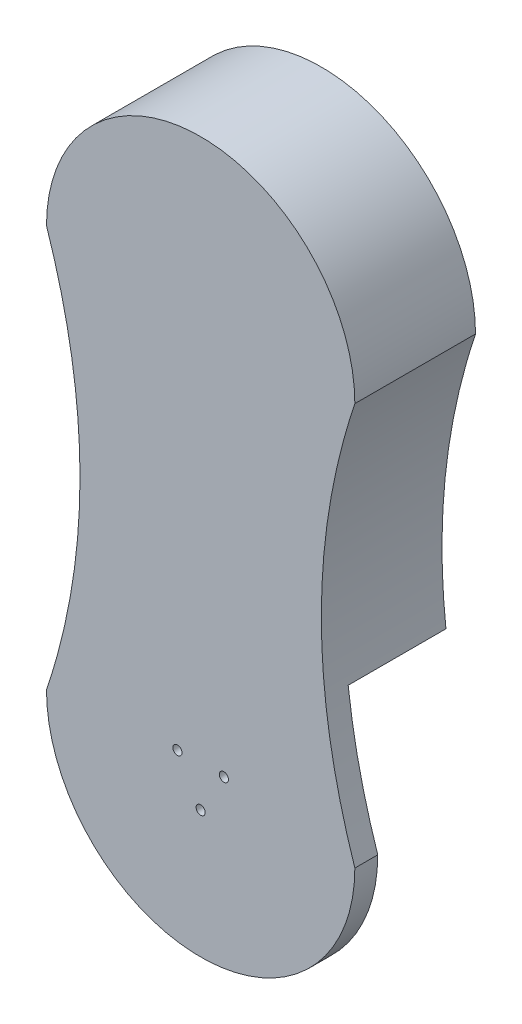
ISO-10303-21;
HEADER;
FILE_DESCRIPTION(('STEP AP214'),'2;1');
FILE_NAME('part.step','',(''),(''),'','','');
FILE_SCHEMA(('AUTOMOTIVE_DESIGN { 1 0 10303 214 1 1 1 1 }'));
ENDSEC;
DATA;
#1=APPLICATION_CONTEXT('core data for automotive mechanical design processes');
#2=APPLICATION_PROTOCOL_DEFINITION('international standard','automotive_design',2000,#1);
#3=PRODUCT_CONTEXT('',#1,'mechanical');
#4=PRODUCT('Part','Part','',(#3));
#5=PRODUCT_RELATED_PRODUCT_CATEGORY('part','',(#4));
#6=PRODUCT_DEFINITION_FORMATION('','',#4);
#7=PRODUCT_DEFINITION_CONTEXT('part definition',#1,'design');
#8=PRODUCT_DEFINITION('design','',#6,#7);
#9=PRODUCT_DEFINITION_SHAPE('','',#8);
#10=(LENGTH_UNIT() NAMED_UNIT(*) SI_UNIT(.MILLI.,.METRE.));
#11=(NAMED_UNIT(*) PLANE_ANGLE_UNIT() SI_UNIT($,.RADIAN.));
#12=(NAMED_UNIT(*) SI_UNIT($,.STERADIAN.) SOLID_ANGLE_UNIT());
#13=UNCERTAINTY_MEASURE_WITH_UNIT(LENGTH_MEASURE(1.E-05),#10,'distance_accuracy_value','');
#14=(GEOMETRIC_REPRESENTATION_CONTEXT(3) GLOBAL_UNCERTAINTY_ASSIGNED_CONTEXT((#13)) GLOBAL_UNIT_ASSIGNED_CONTEXT((#10,
#11,#12)) REPRESENTATION_CONTEXT('',''));
#15=CARTESIAN_POINT('',(0.,0.,0.));
#16=DIRECTION('',(0.,0.,1.));
#17=DIRECTION('',(1.,0.,0.));
#18=AXIS2_PLACEMENT_3D('',#15,#16,#17);
#19=CARTESIAN_POINT('',(0.,0.,90.));
#20=DIRECTION('',(0.,0.,-1.));
#21=DIRECTION('',(-1.,0.,0.));
#22=AXIS2_PLACEMENT_3D('',#19,#20,#21);
#23=CYLINDRICAL_SURFACE('',#22,115.);
#24=CARTESIAN_POINT('',(0.,0.,72.91));
#25=DIRECTION('',(0.,0.,-1.));
#26=DIRECTION('',(-1.,0.,0.));
#27=AXIS2_PLACEMENT_3D('',#24,#25,#26);
#28=CIRCLE('',#27,115.);
#29=CARTESIAN_POINT('',(-115.,0.,72.91));
#30=VERTEX_POINT('',#29);
#31=CARTESIAN_POINT('',(115.000000039863,-1.19495524586455E-07,72.91));
#32=VERTEX_POINT('',#31);
#33=EDGE_CURVE('E150',#30,#32,#28,.F.);
#34=ORIENTED_EDGE('',*,*,#33,.T.);
#35=DIRECTION('',(0.,0.,-1.));
#36=VECTOR('',#35,1.);
#37=CARTESIAN_POINT('',(115.,0.,90.));
#38=LINE('',#37,#36);
#39=CARTESIAN_POINT('',(115.,0.,90.));
#40=VERTEX_POINT('',#39);
#41=EDGE_CURVE('E51',#40,#32,#38,.T.);
#42=ORIENTED_EDGE('',*,*,#41,.F.);
#43=CARTESIAN_POINT('',(0.,0.,90.));
#44=DIRECTION('',(0.,0.,1.));
#45=DIRECTION('',(1.,0.,0.));
#46=AXIS2_PLACEMENT_3D('',#43,#44,#45);
#47=CIRCLE('',#46,115.);
#48=CARTESIAN_POINT('',(-115.,0.,90.));
#49=VERTEX_POINT('',#48);
#50=EDGE_CURVE('E90',#49,#40,#47,.T.);
#51=ORIENTED_EDGE('',*,*,#50,.F.);
#52=DIRECTION('',(0.,0.,-1.));
#53=VECTOR('',#52,1.);
#54=CARTESIAN_POINT('',(-115.,0.,90.));
#55=LINE('',#54,#53);
#56=EDGE_CURVE('E11',#49,#30,#55,.T.);
#57=ORIENTED_EDGE('',*,*,#56,.T.);
#58=EDGE_LOOP('',(#34,#42,#51,#57));
#59=FACE_BOUND('',#58,.T.);
#60=ADVANCED_FACE('F39',(#59),#23,.T.);
#61=CARTESIAN_POINT('',(-115.,300.,90.));
#62=CARTESIAN_POINT('',(-65.,150.,90.));
#63=CARTESIAN_POINT('',(-115.,0.,90.));
#64=B_SPLINE_CURVE_WITH_KNOTS('',2,(#61,#62,#63),.UNSPECIFIED.,.F.,.F.,(3,3),(0.,1.),.UNSPECIFIED.);
#65=DIRECTION('',(0.,0.,-1.));
#66=VECTOR('',#65,1.);
#67=SURFACE_OF_LINEAR_EXTRUSION('',#64,#66);
#68=CARTESIAN_POINT('',(-115.,300.,0.));
#69=CARTESIAN_POINT('',(-65.,150.,0.));
#70=CARTESIAN_POINT('',(-115.,0.,0.));
#71=B_SPLINE_CURVE_WITH_KNOTS('',2,(#68,#69,#70),.UNSPECIFIED.,.F.,.F.,(3,3),(0.,1.),.UNSPECIFIED.);
#72=CARTESIAN_POINT('',(-115.,300.,0.));
#73=VERTEX_POINT('',#72);
#74=CARTESIAN_POINT('',(-92.9457026485694,98.5108517868819,0.));
#75=VERTEX_POINT('',#74);
#76=EDGE_CURVE('E123',#73,#75,#71,.T.);
#77=ORIENTED_EDGE('',*,*,#76,.T.);
#78=DIRECTION('',(0.,0.,-1.));
#79=VECTOR('',#78,1.);
#80=CARTESIAN_POINT('',(-92.9457026486031,98.5108517868643,403.27659252074));
#81=LINE('',#80,#79);
#82=CARTESIAN_POINT('',(-92.9457026486031,98.5108517868643,72.91));
#83=VERTEX_POINT('',#82);
#84=EDGE_CURVE('E59',#83,#75,#81,.T.);
#85=ORIENTED_EDGE('',*,*,#84,.F.);
#86=CARTESIAN_POINT('',(-1000090.,-29850.,72.91));
#87=CARTESIAN_POINT('',(999910.,149.999999999999,72.91));
#88=CARTESIAN_POINT('',(-1000090.,30150.,72.91));
#89=B_SPLINE_CURVE_WITH_KNOTS('',2,(#86,#87,#88),.UNSPECIFIED.,.F.,.F.,(3,3),(0.,1.),.UNSPECIFIED.);
#90=EDGE_CURVE('E155',#83,#30,#89,.F.);
#91=ORIENTED_EDGE('',*,*,#90,.T.);
#92=ORIENTED_EDGE('',*,*,#56,.F.);
#93=CARTESIAN_POINT('',(-115.,300.,90.));
#94=VERTEX_POINT('',#93);
#95=EDGE_CURVE('E125',#94,#49,#64,.T.);
#96=ORIENTED_EDGE('',*,*,#95,.F.);
#97=DIRECTION('',(0.,0.,-1.));
#98=VECTOR('',#97,1.);
#99=CARTESIAN_POINT('',(-115.,300.,90.));
#100=LINE('',#99,#98);
#101=EDGE_CURVE('E145',#94,#73,#100,.T.);
#102=ORIENTED_EDGE('',*,*,#101,.T.);
#103=EDGE_LOOP('',(#77,#85,#91,#92,#96,#102));
#104=FACE_BOUND('',#103,.T.);
#105=ADVANCED_FACE('F41',(#104),#67,.F.);
#106=CARTESIAN_POINT('',(115.,0.,90.));
#107=CARTESIAN_POINT('',(65.,150.,90.));
#108=CARTESIAN_POINT('',(115.,300.,90.));
#109=B_SPLINE_CURVE_WITH_KNOTS('',2,(#106,#107,#108),.UNSPECIFIED.,.F.,.F.,(3,3),(0.,1.),.UNSPECIFIED.);
#110=DIRECTION('',(0.,0.,-1.));
#111=VECTOR('',#110,1.);
#112=SURFACE_OF_LINEAR_EXTRUSION('',#109,#111);
#113=CARTESIAN_POINT('',(1000090.,30150.,72.91));
#114=CARTESIAN_POINT('',(-999910.,149.999999999999,72.91));
#115=CARTESIAN_POINT('',(1000090.,-29850.,72.91));
#116=B_SPLINE_CURVE_WITH_KNOTS('',2,(#113,#114,#115),.UNSPECIFIED.,.F.,.F.,(3,3),(0.,1.),.UNSPECIFIED.);
#117=CARTESIAN_POINT('',(92.9457026486032,98.5108517868643,72.91));
#118=VERTEX_POINT('',#117);
#119=EDGE_CURVE('E120',#32,#118,#116,.F.);
#120=ORIENTED_EDGE('',*,*,#119,.T.);
#121=DIRECTION('',(0.,0.,-1.));
#122=VECTOR('',#121,1.);
#123=CARTESIAN_POINT('',(92.9457026486032,98.5108517868643,403.27659252074));
#124=LINE('',#123,#122);
#125=CARTESIAN_POINT('',(92.9457026486032,98.5108517868643,0.));
#126=VERTEX_POINT('',#125);
#127=EDGE_CURVE('E106',#118,#126,#124,.T.);
#128=ORIENTED_EDGE('',*,*,#127,.T.);
#129=CARTESIAN_POINT('',(115.,0.,0.));
#130=CARTESIAN_POINT('',(65.,150.,0.));
#131=CARTESIAN_POINT('',(115.,300.,0.));
#132=B_SPLINE_CURVE_WITH_KNOTS('',2,(#129,#130,#131),.UNSPECIFIED.,.F.,.F.,(3,3),(0.,1.),.UNSPECIFIED.);
#133=CARTESIAN_POINT('',(115.,300.,0.));
#134=VERTEX_POINT('',#133);
#135=EDGE_CURVE('E118',#126,#134,#132,.T.);
#136=ORIENTED_EDGE('',*,*,#135,.T.);
#137=DIRECTION('',(0.,0.,-1.));
#138=VECTOR('',#137,1.);
#139=CARTESIAN_POINT('',(115.,300.,90.));
#140=LINE('',#139,#138);
#141=CARTESIAN_POINT('',(115.,300.,90.));
#142=VERTEX_POINT('',#141);
#143=EDGE_CURVE('E146',#142,#134,#140,.T.);
#144=ORIENTED_EDGE('',*,*,#143,.F.);
#145=EDGE_CURVE('E148',#40,#142,#109,.T.);
#146=ORIENTED_EDGE('',*,*,#145,.F.);
#147=ORIENTED_EDGE('',*,*,#41,.T.);
#148=EDGE_LOOP('',(#120,#128,#136,#144,#146,#147));
#149=FACE_BOUND('',#148,.T.);
#150=ADVANCED_FACE('F116',(#149),#112,.F.);
#151=CARTESIAN_POINT('',(0.,300.,90.));
#152=DIRECTION('',(0.,0.,-1.));
#153=DIRECTION('',(-1.,0.,0.));
#154=AXIS2_PLACEMENT_3D('',#151,#152,#153);
#155=CYLINDRICAL_SURFACE('',#154,115.);
#156=CARTESIAN_POINT('',(0.,300.,0.));
#157=DIRECTION('',(0.,0.,1.));
#158=DIRECTION('',(1.,0.,0.));
#159=AXIS2_PLACEMENT_3D('',#156,#157,#158);
#160=CIRCLE('',#159,115.);
#161=EDGE_CURVE('E83',#134,#73,#160,.T.);
#162=ORIENTED_EDGE('',*,*,#161,.T.);
#163=ORIENTED_EDGE('',*,*,#101,.F.);
#164=CARTESIAN_POINT('',(0.,300.,90.));
#165=DIRECTION('',(0.,0.,1.));
#166=DIRECTION('',(1.,0.,0.));
#167=AXIS2_PLACEMENT_3D('',#164,#165,#166);
#168=CIRCLE('',#167,115.);
#169=EDGE_CURVE('E68',#142,#94,#168,.T.);
#170=ORIENTED_EDGE('',*,*,#169,.F.);
#171=ORIENTED_EDGE('',*,*,#143,.T.);
#172=EDGE_LOOP('',(#162,#163,#170,#171));
#173=FACE_BOUND('',#172,.T.);
#174=ADVANCED_FACE('F199',(#173),#155,.T.);
#175=CARTESIAN_POINT('',(-90.,150.,90.));
#176=DIRECTION('',(0.,0.,-1.));
#177=DIRECTION('',(-1.,0.,0.));
#178=AXIS2_PLACEMENT_3D('',#175,#176,#177);
#179=PLANE('',#178);
#180=CARTESIAN_POINT('',(0.,-20.,90.));
#181=DIRECTION('',(0.,0.,-1.));
#182=DIRECTION('',(-1.,0.,0.));
#183=AXIS2_PLACEMENT_3D('',#180,#181,#182);
#184=CIRCLE('',#183,3.4);
#185=CARTESIAN_POINT('',(-3.4,-20.,90.));
#186=VERTEX_POINT('',#185);
#187=EDGE_CURVE('E112',#186,#186,#184,.F.);
#188=ORIENTED_EDGE('',*,*,#187,.F.);
#189=EDGE_LOOP('',(#188));
#190=FACE_BOUND('',#189,.T.);
#191=CARTESIAN_POINT('',(-17.3205080756887,10.0000000000001,90.));
#192=DIRECTION('',(0.,0.,-1.));
#193=DIRECTION('',(-1.,0.,0.));
#194=AXIS2_PLACEMENT_3D('',#191,#192,#193);
#195=CIRCLE('',#194,3.4);
#196=CARTESIAN_POINT('',(-20.7205080756887,10.0000000000001,90.));
#197=VERTEX_POINT('',#196);
#198=EDGE_CURVE('E249',#197,#197,#195,.F.);
#199=ORIENTED_EDGE('',*,*,#198,.F.);
#200=EDGE_LOOP('',(#199));
#201=FACE_BOUND('',#200,.T.);
#202=CARTESIAN_POINT('',(17.3205080756889,9.99999999999983,90.));
#203=DIRECTION('',(0.,0.,-1.));
#204=DIRECTION('',(-1.,0.,0.));
#205=AXIS2_PLACEMENT_3D('',#202,#203,#204);
#206=CIRCLE('',#205,3.4);
#207=CARTESIAN_POINT('',(13.9205080756889,9.99999999999983,90.));
#208=VERTEX_POINT('',#207);
#209=EDGE_CURVE('E253',#208,#208,#206,.F.);
#210=ORIENTED_EDGE('',*,*,#209,.F.);
#211=EDGE_LOOP('',(#210));
#212=FACE_BOUND('',#211,.T.);
#213=ORIENTED_EDGE('',*,*,#95,.T.);
#214=ORIENTED_EDGE('',*,*,#50,.T.);
#215=ORIENTED_EDGE('',*,*,#145,.T.);
#216=ORIENTED_EDGE('',*,*,#169,.T.);
#217=EDGE_LOOP('',(#213,#214,#215,#216));
#218=FACE_BOUND('',#217,.T.);
#219=ADVANCED_FACE('F209',(#190,#201,#212,#218),#179,.F.);
#220=CARTESIAN_POINT('',(-90.,150.,0.));
#221=DIRECTION('',(0.,0.,-1.));
#222=DIRECTION('',(-1.,0.,0.));
#223=AXIS2_PLACEMENT_3D('',#220,#221,#222);
#224=PLANE('',#223);
#225=CARTESIAN_POINT('',(0.,-72.3600323995787,0.));
#226=DIRECTION('',(0.,0.,-1.));
#227=DIRECTION('',(-1.,0.,0.));
#228=AXIS2_PLACEMENT_3D('',#225,#226,#227);
#229=CIRCLE('',#228,194.514170958055);
#230=EDGE_CURVE('E103',#75,#126,#229,.T.);
#231=ORIENTED_EDGE('',*,*,#230,.F.);
#232=ORIENTED_EDGE('',*,*,#76,.F.);
#233=ORIENTED_EDGE('',*,*,#161,.F.);
#234=ORIENTED_EDGE('',*,*,#135,.F.);
#235=EDGE_LOOP('',(#231,#232,#233,#234));
#236=FACE_BOUND('',#235,.T.);
#237=ADVANCED_FACE('F122',(#236),#224,.T.);
#238=CARTESIAN_POINT('',(0.,-72.3600323995787,403.27659252074));
#239=DIRECTION('',(0.,0.,-1.));
#240=DIRECTION('',(-1.,0.,0.));
#241=AXIS2_PLACEMENT_3D('',#238,#239,#240);
#242=CYLINDRICAL_SURFACE('',#241,194.514170958055);
#243=CARTESIAN_POINT('',(0.,-72.3600323995787,72.91));
#244=DIRECTION('',(0.,0.,-1.));
#245=DIRECTION('',(-1.,0.,0.));
#246=AXIS2_PLACEMENT_3D('',#243,#244,#245);
#247=CIRCLE('',#246,194.514170958055);
#248=EDGE_CURVE('E127',#118,#83,#247,.F.);
#249=ORIENTED_EDGE('',*,*,#248,.T.);
#250=ORIENTED_EDGE('',*,*,#84,.T.);
#251=ORIENTED_EDGE('',*,*,#230,.T.);
#252=ORIENTED_EDGE('',*,*,#127,.F.);
#253=EDGE_LOOP('',(#249,#250,#251,#252));
#254=FACE_BOUND('',#253,.T.);
#255=ADVANCED_FACE('F105',(#254),#242,.F.);
#256=CARTESIAN_POINT('',(0.,0.,72.91));
#257=DIRECTION('',(0.,0.,-1.));
#258=DIRECTION('',(-1.,0.,0.));
#259=AXIS2_PLACEMENT_3D('',#256,#257,#258);
#260=PLANE('',#259);
#261=CARTESIAN_POINT('',(0.,-20.,72.91));
#262=DIRECTION('',(0.,0.,-1.));
#263=DIRECTION('',(-1.,0.,0.));
#264=AXIS2_PLACEMENT_3D('',#261,#262,#263);
#265=CIRCLE('',#264,3.4);
#266=CARTESIAN_POINT('',(-3.4,-20.,72.91));
#267=VERTEX_POINT('',#266);
#268=EDGE_CURVE('E244',#267,#267,#265,.T.);
#269=ORIENTED_EDGE('',*,*,#268,.F.);
#270=EDGE_LOOP('',(#269));
#271=FACE_BOUND('',#270,.T.);
#272=CARTESIAN_POINT('',(-17.3205080756887,10.0000000000001,72.91));
#273=DIRECTION('',(0.,0.,-1.));
#274=DIRECTION('',(-1.,0.,0.));
#275=AXIS2_PLACEMENT_3D('',#272,#273,#274);
#276=CIRCLE('',#275,3.4);
#277=CARTESIAN_POINT('',(-20.7205080756887,10.0000000000001,72.91));
#278=VERTEX_POINT('',#277);
#279=EDGE_CURVE('E245',#278,#278,#276,.T.);
#280=ORIENTED_EDGE('',*,*,#279,.F.);
#281=EDGE_LOOP('',(#280));
#282=FACE_BOUND('',#281,.T.);
#283=CARTESIAN_POINT('',(17.3205080756889,9.99999999999983,72.91));
#284=DIRECTION('',(0.,0.,-1.));
#285=DIRECTION('',(-1.,0.,0.));
#286=AXIS2_PLACEMENT_3D('',#283,#284,#285);
#287=CIRCLE('',#286,3.4);
#288=CARTESIAN_POINT('',(13.9205080756889,9.99999999999983,72.91));
#289=VERTEX_POINT('',#288);
#290=EDGE_CURVE('E180',#289,#289,#287,.T.);
#291=ORIENTED_EDGE('',*,*,#290,.F.);
#292=EDGE_LOOP('',(#291));
#293=FACE_BOUND('',#292,.T.);
#294=ORIENTED_EDGE('',*,*,#90,.F.);
#295=ORIENTED_EDGE('',*,*,#248,.F.);
#296=ORIENTED_EDGE('',*,*,#119,.F.);
#297=ORIENTED_EDGE('',*,*,#33,.F.);
#298=EDGE_LOOP('',(#294,#295,#296,#297));
#299=FACE_BOUND('',#298,.T.);
#300=ADVANCED_FACE('F223',(#271,#282,#293,#299),#260,.T.);
#301=CARTESIAN_POINT('',(17.3205080756889,9.99999999999983,99.616652224137));
#302=DIRECTION('',(0.,0.,-1.));
#303=DIRECTION('',(-1.,0.,0.));
#304=AXIS2_PLACEMENT_3D('',#301,#302,#303);
#305=CYLINDRICAL_SURFACE('',#304,3.4);
#306=ORIENTED_EDGE('',*,*,#209,.T.);
#307=EDGE_LOOP('',(#306));
#308=FACE_BOUND('',#307,.T.);
#309=ORIENTED_EDGE('',*,*,#290,.T.);
#310=EDGE_LOOP('',(#309));
#311=FACE_BOUND('',#310,.T.);
#312=ADVANCED_FACE('F225',(#308,#311),#305,.F.);
#313=CARTESIAN_POINT('',(-17.3205080756887,10.0000000000001,99.616652224137));
#314=DIRECTION('',(0.,0.,-1.));
#315=DIRECTION('',(-1.,0.,0.));
#316=AXIS2_PLACEMENT_3D('',#313,#314,#315);
#317=CYLINDRICAL_SURFACE('',#316,3.4);
#318=ORIENTED_EDGE('',*,*,#198,.T.);
#319=EDGE_LOOP('',(#318));
#320=FACE_BOUND('',#319,.T.);
#321=ORIENTED_EDGE('',*,*,#279,.T.);
#322=EDGE_LOOP('',(#321));
#323=FACE_BOUND('',#322,.T.);
#324=ADVANCED_FACE('F230',(#320,#323),#317,.F.);
#325=CARTESIAN_POINT('',(0.,-20.,99.616652224137));
#326=DIRECTION('',(0.,0.,-1.));
#327=DIRECTION('',(-1.,0.,0.));
#328=AXIS2_PLACEMENT_3D('',#325,#326,#327);
#329=CYLINDRICAL_SURFACE('',#328,3.4);
#330=ORIENTED_EDGE('',*,*,#187,.T.);
#331=EDGE_LOOP('',(#330));
#332=FACE_BOUND('',#331,.T.);
#333=ORIENTED_EDGE('',*,*,#268,.T.);
#334=EDGE_LOOP('',(#333));
#335=FACE_BOUND('',#334,.T.);
#336=ADVANCED_FACE('F234',(#332,#335),#329,.F.);
#337=CLOSED_SHELL('',(#60,#105,#150,#174,#219,#237,#255,#300,#312,#324,#336));
#338=MANIFOLD_SOLID_BREP('B2',#337);
#339=ADVANCED_BREP_SHAPE_REPRESENTATION('',(#18,#338),#14);
#340=SHAPE_DEFINITION_REPRESENTATION(#9,#339);
ENDSEC;
END-ISO-10303-21;
